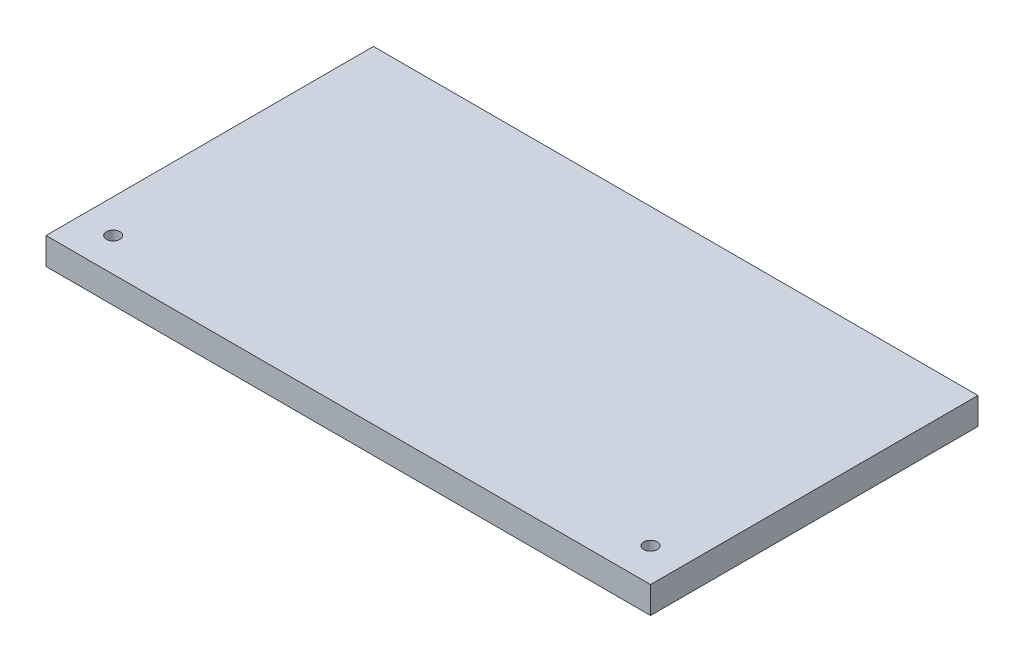
ISO-10303-21;
HEADER;
FILE_DESCRIPTION(('STEP AP214'),'2;1');
FILE_NAME('part.step','',(''),(''),'','','');
FILE_SCHEMA(('AUTOMOTIVE_DESIGN { 1 0 10303 214 1 1 1 1 }'));
ENDSEC;
DATA;
#1=APPLICATION_CONTEXT('core data for automotive mechanical design processes');
#2=APPLICATION_PROTOCOL_DEFINITION('international standard','automotive_design',2000,#1);
#3=PRODUCT_CONTEXT('',#1,'mechanical');
#4=PRODUCT('Part','Part','',(#3));
#5=PRODUCT_RELATED_PRODUCT_CATEGORY('part','',(#4));
#6=PRODUCT_DEFINITION_FORMATION('','',#4);
#7=PRODUCT_DEFINITION_CONTEXT('part definition',#1,'design');
#8=PRODUCT_DEFINITION('design','',#6,#7);
#9=PRODUCT_DEFINITION_SHAPE('','',#8);
#10=(LENGTH_UNIT() NAMED_UNIT(*) SI_UNIT(.MILLI.,.METRE.));
#11=(NAMED_UNIT(*) PLANE_ANGLE_UNIT() SI_UNIT($,.RADIAN.));
#12=(NAMED_UNIT(*) SI_UNIT($,.STERADIAN.) SOLID_ANGLE_UNIT());
#13=UNCERTAINTY_MEASURE_WITH_UNIT(LENGTH_MEASURE(1.E-05),#10,'distance_accuracy_value','');
#14=(GEOMETRIC_REPRESENTATION_CONTEXT(3) GLOBAL_UNCERTAINTY_ASSIGNED_CONTEXT((#13)) GLOBAL_UNIT_ASSIGNED_CONTEXT((#10,
#11,#12)) REPRESENTATION_CONTEXT('',''));
#15=CARTESIAN_POINT('',(0.,0.,0.));
#16=DIRECTION('',(0.,0.,1.));
#17=DIRECTION('',(1.,0.,0.));
#18=AXIS2_PLACEMENT_3D('',#15,#16,#17);
#19=CARTESIAN_POINT('',(0.,16.,0.));
#20=DIRECTION('',(0.,1.,0.));
#21=DIRECTION('',(0.,0.,1.));
#22=AXIS2_PLACEMENT_3D('',#19,#20,#21);
#23=PLANE('',#22);
#24=CARTESIAN_POINT('',(-340.,16.,-20.));
#25=DIRECTION('',(0.,1.,0.));
#26=DIRECTION('',(0.,0.,1.));
#27=AXIS2_PLACEMENT_3D('',#24,#25,#26);
#28=CIRCLE('',#27,3.99999999999999);
#29=CARTESIAN_POINT('',(-340.,16.,-16.));
#30=VERTEX_POINT('',#29);
#31=EDGE_CURVE('E102',#30,#30,#28,.T.);
#32=ORIENTED_EDGE('',*,*,#31,.F.);
#33=EDGE_LOOP('',(#32));
#34=FACE_BOUND('',#33,.T.);
#35=DIRECTION('',(0.,0.,1.));
#36=VECTOR('',#35,1.);
#37=CARTESIAN_POINT('',(-360.,16.,-195.));
#38=LINE('',#37,#36);
#39=CARTESIAN_POINT('',(-360.,16.,-195.));
#40=VERTEX_POINT('',#39);
#41=CARTESIAN_POINT('',(-360.,16.,0.));
#42=VERTEX_POINT('',#41);
#43=EDGE_CURVE('E87',#40,#42,#38,.T.);
#44=ORIENTED_EDGE('',*,*,#43,.T.);
#45=DIRECTION('',(1.,0.,0.));
#46=VECTOR('',#45,1.);
#47=CARTESIAN_POINT('',(-360.,16.,0.));
#48=LINE('',#47,#46);
#49=CARTESIAN_POINT('',(0.,16.,0.));
#50=VERTEX_POINT('',#49);
#51=EDGE_CURVE('E82',#42,#50,#48,.T.);
#52=ORIENTED_EDGE('',*,*,#51,.T.);
#53=DIRECTION('',(0.,0.,-1.));
#54=VECTOR('',#53,1.);
#55=CARTESIAN_POINT('',(0.,16.,-195.));
#56=LINE('',#55,#54);
#57=CARTESIAN_POINT('',(0.,16.,-195.));
#58=VERTEX_POINT('',#57);
#59=EDGE_CURVE('E85',#50,#58,#56,.T.);
#60=ORIENTED_EDGE('',*,*,#59,.T.);
#61=DIRECTION('',(-1.,0.,0.));
#62=VECTOR('',#61,1.);
#63=CARTESIAN_POINT('',(-360.,16.,-195.));
#64=LINE('',#63,#62);
#65=EDGE_CURVE('E52',#58,#40,#64,.T.);
#66=ORIENTED_EDGE('',*,*,#65,.T.);
#67=EDGE_LOOP('',(#44,#52,#60,#66));
#68=FACE_BOUND('',#67,.T.);
#69=CARTESIAN_POINT('',(-20.,16.,-20.));
#70=DIRECTION('',(0.,1.,0.));
#71=DIRECTION('',(0.,0.,1.));
#72=AXIS2_PLACEMENT_3D('',#69,#70,#71);
#73=CIRCLE('',#72,4.00000000000001);
#74=CARTESIAN_POINT('',(-20.,16.,-16.));
#75=VERTEX_POINT('',#74);
#76=EDGE_CURVE('E117',#75,#75,#73,.T.);
#77=ORIENTED_EDGE('',*,*,#76,.F.);
#78=EDGE_LOOP('',(#77));
#79=FACE_BOUND('',#78,.T.);
#80=ADVANCED_FACE('F35',(#34,#68,#79),#23,.T.);
#81=CARTESIAN_POINT('',(0.,0.,0.));
#82=DIRECTION('',(0.,1.,0.));
#83=DIRECTION('',(0.,0.,1.));
#84=AXIS2_PLACEMENT_3D('',#81,#82,#83);
#85=PLANE('',#84);
#86=CARTESIAN_POINT('',(-340.,0.,-20.));
#87=DIRECTION('',(0.,1.,0.));
#88=DIRECTION('',(0.,0.,1.));
#89=AXIS2_PLACEMENT_3D('',#86,#87,#88);
#90=CIRCLE('',#89,3.99999999999999);
#91=CARTESIAN_POINT('',(-340.,0.,-16.));
#92=VERTEX_POINT('',#91);
#93=EDGE_CURVE('E114',#92,#92,#90,.T.);
#94=ORIENTED_EDGE('',*,*,#93,.T.);
#95=EDGE_LOOP('',(#94));
#96=FACE_BOUND('',#95,.T.);
#97=DIRECTION('',(0.,0.,1.));
#98=VECTOR('',#97,1.);
#99=CARTESIAN_POINT('',(-360.,0.,-195.));
#100=LINE('',#99,#98);
#101=CARTESIAN_POINT('',(-360.,0.,-195.));
#102=VERTEX_POINT('',#101);
#103=CARTESIAN_POINT('',(-360.,0.,0.));
#104=VERTEX_POINT('',#103);
#105=EDGE_CURVE('E99',#102,#104,#100,.T.);
#106=ORIENTED_EDGE('',*,*,#105,.F.);
#107=DIRECTION('',(-1.,0.,0.));
#108=VECTOR('',#107,1.);
#109=CARTESIAN_POINT('',(-360.,0.,-195.));
#110=LINE('',#109,#108);
#111=CARTESIAN_POINT('',(0.,0.,-195.));
#112=VERTEX_POINT('',#111);
#113=EDGE_CURVE('E75',#112,#102,#110,.T.);
#114=ORIENTED_EDGE('',*,*,#113,.F.);
#115=DIRECTION('',(0.,0.,-1.));
#116=VECTOR('',#115,1.);
#117=CARTESIAN_POINT('',(0.,0.,-195.));
#118=LINE('',#117,#116);
#119=CARTESIAN_POINT('',(0.,0.,0.));
#120=VERTEX_POINT('',#119);
#121=EDGE_CURVE('E69',#120,#112,#118,.T.);
#122=ORIENTED_EDGE('',*,*,#121,.F.);
#123=DIRECTION('',(1.,0.,0.));
#124=VECTOR('',#123,1.);
#125=CARTESIAN_POINT('',(-360.,0.,0.));
#126=LINE('',#125,#124);
#127=EDGE_CURVE('E91',#104,#120,#126,.T.);
#128=ORIENTED_EDGE('',*,*,#127,.F.);
#129=EDGE_LOOP('',(#106,#114,#122,#128));
#130=FACE_BOUND('',#129,.T.);
#131=CARTESIAN_POINT('',(-20.,0.,-20.));
#132=DIRECTION('',(0.,1.,0.));
#133=DIRECTION('',(0.,0.,1.));
#134=AXIS2_PLACEMENT_3D('',#131,#132,#133);
#135=CIRCLE('',#134,4.00000000000001);
#136=CARTESIAN_POINT('',(-20.,0.,-16.));
#137=VERTEX_POINT('',#136);
#138=EDGE_CURVE('E120',#137,#137,#135,.T.);
#139=ORIENTED_EDGE('',*,*,#138,.T.);
#140=EDGE_LOOP('',(#139));
#141=FACE_BOUND('',#140,.T.);
#142=ADVANCED_FACE('F110',(#96,#130,#141),#85,.F.);
#143=CARTESIAN_POINT('',(-360.,16.,-195.));
#144=DIRECTION('',(1.,0.,0.));
#145=DIRECTION('',(0.,0.,-1.));
#146=AXIS2_PLACEMENT_3D('',#143,#144,#145);
#147=PLANE('',#146);
#148=ORIENTED_EDGE('',*,*,#105,.T.);
#149=DIRECTION('',(0.,-1.,0.));
#150=VECTOR('',#149,1.);
#151=CARTESIAN_POINT('',(-360.,16.,0.));
#152=LINE('',#151,#150);
#153=EDGE_CURVE('E11',#42,#104,#152,.T.);
#154=ORIENTED_EDGE('',*,*,#153,.F.);
#155=ORIENTED_EDGE('',*,*,#43,.F.);
#156=DIRECTION('',(0.,-1.,0.));
#157=VECTOR('',#156,1.);
#158=CARTESIAN_POINT('',(-360.,16.,-195.));
#159=LINE('',#158,#157);
#160=EDGE_CURVE('E95',#40,#102,#159,.T.);
#161=ORIENTED_EDGE('',*,*,#160,.T.);
#162=EDGE_LOOP('',(#148,#154,#155,#161));
#163=FACE_BOUND('',#162,.T.);
#164=ADVANCED_FACE('F37',(#163),#147,.F.);
#165=CARTESIAN_POINT('',(-360.,16.,0.));
#166=DIRECTION('',(0.,0.,-1.));
#167=DIRECTION('',(-1.,0.,0.));
#168=AXIS2_PLACEMENT_3D('',#165,#166,#167);
#169=PLANE('',#168);
#170=ORIENTED_EDGE('',*,*,#127,.T.);
#171=DIRECTION('',(0.,-1.,0.));
#172=VECTOR('',#171,1.);
#173=CARTESIAN_POINT('',(0.,16.,0.));
#174=LINE('',#173,#172);
#175=EDGE_CURVE('E44',#50,#120,#174,.T.);
#176=ORIENTED_EDGE('',*,*,#175,.F.);
#177=ORIENTED_EDGE('',*,*,#51,.F.);
#178=ORIENTED_EDGE('',*,*,#153,.T.);
#179=EDGE_LOOP('',(#170,#176,#177,#178));
#180=FACE_BOUND('',#179,.T.);
#181=ADVANCED_FACE('F90',(#180),#169,.F.);
#182=CARTESIAN_POINT('',(0.,16.,-195.));
#183=DIRECTION('',(-1.,0.,0.));
#184=DIRECTION('',(0.,0.,1.));
#185=AXIS2_PLACEMENT_3D('',#182,#183,#184);
#186=PLANE('',#185);
#187=ORIENTED_EDGE('',*,*,#121,.T.);
#188=DIRECTION('',(0.,-1.,0.));
#189=VECTOR('',#188,1.);
#190=CARTESIAN_POINT('',(0.,16.,-195.));
#191=LINE('',#190,#189);
#192=EDGE_CURVE('E92',#58,#112,#191,.T.);
#193=ORIENTED_EDGE('',*,*,#192,.F.);
#194=ORIENTED_EDGE('',*,*,#59,.F.);
#195=ORIENTED_EDGE('',*,*,#175,.T.);
#196=EDGE_LOOP('',(#187,#193,#194,#195));
#197=FACE_BOUND('',#196,.T.);
#198=ADVANCED_FACE('F93',(#197),#186,.F.);
#199=CARTESIAN_POINT('',(-360.,16.,-195.));
#200=DIRECTION('',(0.,0.,1.));
#201=DIRECTION('',(1.,0.,0.));
#202=AXIS2_PLACEMENT_3D('',#199,#200,#201);
#203=PLANE('',#202);
#204=ORIENTED_EDGE('',*,*,#113,.T.);
#205=ORIENTED_EDGE('',*,*,#160,.F.);
#206=ORIENTED_EDGE('',*,*,#65,.F.);
#207=ORIENTED_EDGE('',*,*,#192,.T.);
#208=EDGE_LOOP('',(#204,#205,#206,#207));
#209=FACE_BOUND('',#208,.T.);
#210=ADVANCED_FACE('F107',(#209),#203,.F.);
#211=CARTESIAN_POINT('',(-340.,16.,-20.));
#212=DIRECTION('',(0.,-1.,0.));
#213=DIRECTION('',(0.,0.,-1.));
#214=AXIS2_PLACEMENT_3D('',#211,#212,#213);
#215=CYLINDRICAL_SURFACE('',#214,3.99999999999999);
#216=ORIENTED_EDGE('',*,*,#31,.T.);
#217=EDGE_LOOP('',(#216));
#218=FACE_BOUND('',#217,.T.);
#219=ORIENTED_EDGE('',*,*,#93,.F.);
#220=EDGE_LOOP('',(#219));
#221=FACE_BOUND('',#220,.T.);
#222=ADVANCED_FACE('F138',(#218,#221),#215,.F.);
#223=CARTESIAN_POINT('',(-20.,16.,-20.));
#224=DIRECTION('',(0.,-1.,0.));
#225=DIRECTION('',(0.,0.,-1.));
#226=AXIS2_PLACEMENT_3D('',#223,#224,#225);
#227=CYLINDRICAL_SURFACE('',#226,4.00000000000001);
#228=ORIENTED_EDGE('',*,*,#76,.T.);
#229=EDGE_LOOP('',(#228));
#230=FACE_BOUND('',#229,.T.);
#231=ORIENTED_EDGE('',*,*,#138,.F.);
#232=EDGE_LOOP('',(#231));
#233=FACE_BOUND('',#232,.T.);
#234=ADVANCED_FACE('F126',(#230,#233),#227,.F.);
#235=CLOSED_SHELL('',(#80,#142,#164,#181,#198,#210,#222,#234));
#236=MANIFOLD_SOLID_BREP('B2',#235);
#237=ADVANCED_BREP_SHAPE_REPRESENTATION('',(#18,#236),#14);
#238=SHAPE_DEFINITION_REPRESENTATION(#9,#237);
ENDSEC;
END-ISO-10303-21;
